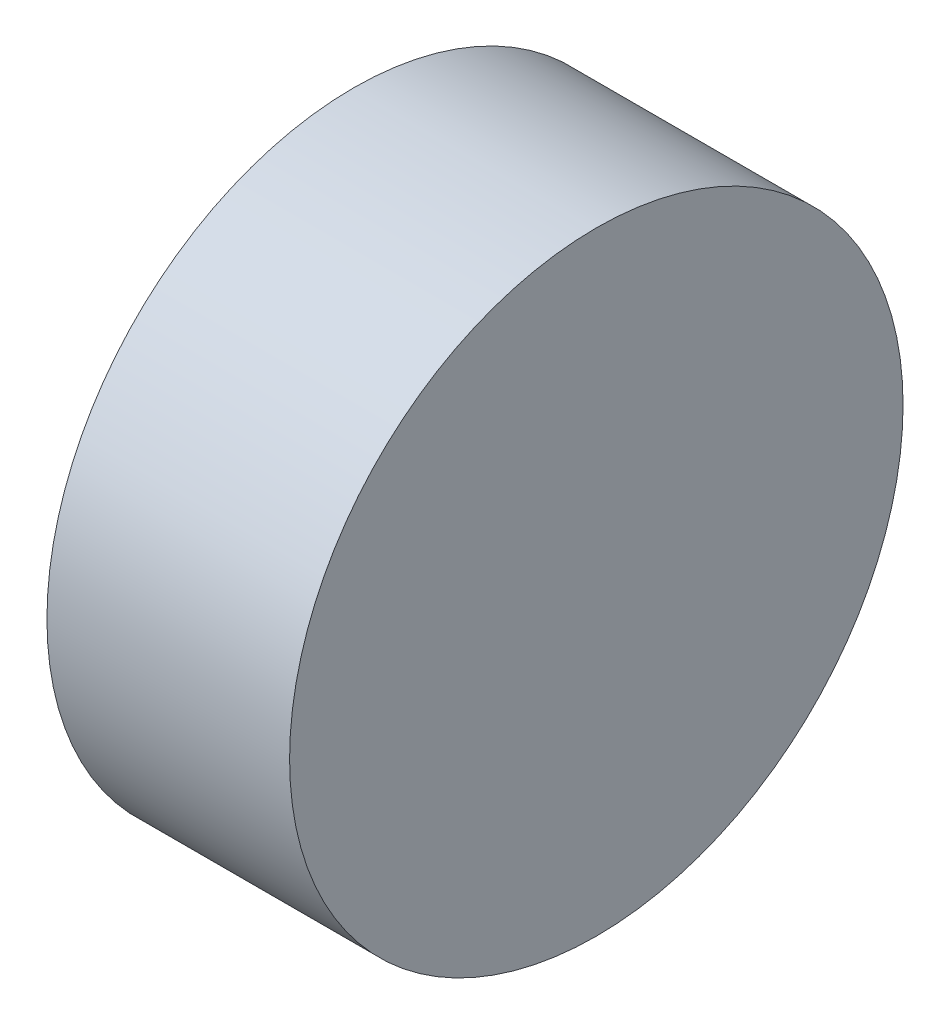
ISO-10303-21;
HEADER;
FILE_DESCRIPTION(('STEP AP214'),'2;1');
FILE_NAME('part.step','',(''),(''),'','','');
FILE_SCHEMA(('AUTOMOTIVE_DESIGN { 1 0 10303 214 1 1 1 1 }'));
ENDSEC;
DATA;
#1=APPLICATION_CONTEXT('core data for automotive mechanical design processes');
#2=APPLICATION_PROTOCOL_DEFINITION('international standard','automotive_design',2000,#1);
#3=PRODUCT_CONTEXT('',#1,'mechanical');
#4=PRODUCT('Part','Part','',(#3));
#5=PRODUCT_RELATED_PRODUCT_CATEGORY('part','',(#4));
#6=PRODUCT_DEFINITION_FORMATION('','',#4);
#7=PRODUCT_DEFINITION_CONTEXT('part definition',#1,'design');
#8=PRODUCT_DEFINITION('design','',#6,#7);
#9=PRODUCT_DEFINITION_SHAPE('','',#8);
#10=(LENGTH_UNIT() NAMED_UNIT(*) SI_UNIT(.MILLI.,.METRE.));
#11=(NAMED_UNIT(*) PLANE_ANGLE_UNIT() SI_UNIT($,.RADIAN.));
#12=(NAMED_UNIT(*) SI_UNIT($,.STERADIAN.) SOLID_ANGLE_UNIT());
#13=UNCERTAINTY_MEASURE_WITH_UNIT(LENGTH_MEASURE(1.E-05),#10,'distance_accuracy_value','');
#14=(GEOMETRIC_REPRESENTATION_CONTEXT(3) GLOBAL_UNCERTAINTY_ASSIGNED_CONTEXT((#13)) GLOBAL_UNIT_ASSIGNED_CONTEXT((#10,
#11,#12)) REPRESENTATION_CONTEXT('',''));
#15=CARTESIAN_POINT('',(0.,0.,0.));
#16=DIRECTION('',(0.,0.,1.));
#17=DIRECTION('',(1.,0.,0.));
#18=AXIS2_PLACEMENT_3D('',#15,#16,#17);
#19=CARTESIAN_POINT('',(0.,0.,0.));
#20=DIRECTION('',(1.,0.,0.));
#21=DIRECTION('',(0.,0.,-1.));
#22=AXIS2_PLACEMENT_3D('',#19,#20,#21);
#23=PLANE('',#22);
#24=CARTESIAN_POINT('',(0.,0.,0.));
#25=DIRECTION('',(1.,0.,0.));
#26=DIRECTION('',(0.,0.,-1.));
#27=AXIS2_PLACEMENT_3D('',#24,#25,#26);
#28=CIRCLE('',#27,33.5);
#29=CARTESIAN_POINT('',(0.,0.,-33.5));
#30=VERTEX_POINT('',#29);
#31=EDGE_CURVE('E44',#30,#30,#28,.T.);
#32=ORIENTED_EDGE('',*,*,#31,.F.);
#33=EDGE_LOOP('',(#32));
#34=FACE_BOUND('',#33,.T.);
#35=CARTESIAN_POINT('',(0.,0.,0.));
#36=DIRECTION('',(1.,0.,0.));
#37=DIRECTION('',(0.,0.,-1.));
#38=AXIS2_PLACEMENT_3D('',#35,#36,#37);
#39=CIRCLE('',#38,5.75);
#40=CARTESIAN_POINT('',(0.,0.,-5.75));
#41=VERTEX_POINT('',#40);
#42=EDGE_CURVE('E10',#41,#41,#39,.F.);
#43=ORIENTED_EDGE('',*,*,#42,.F.);
#44=EDGE_LOOP('',(#43));
#45=FACE_BOUND('',#44,.T.);
#46=ADVANCED_FACE('F33',(#34,#45),#23,.F.);
#47=CARTESIAN_POINT('',(26.5,0.,0.));
#48=DIRECTION('',(-1.,0.,0.));
#49=DIRECTION('',(0.,0.,1.));
#50=AXIS2_PLACEMENT_3D('',#47,#48,#49);
#51=CYLINDRICAL_SURFACE('',#50,33.5);
#52=CARTESIAN_POINT('',(26.5,0.,0.));
#53=DIRECTION('',(1.,0.,0.));
#54=DIRECTION('',(0.,0.,-1.));
#55=AXIS2_PLACEMENT_3D('',#52,#53,#54);
#56=CIRCLE('',#55,33.5);
#57=CARTESIAN_POINT('',(26.5,0.,-33.5));
#58=VERTEX_POINT('',#57);
#59=EDGE_CURVE('E40',#58,#58,#56,.T.);
#60=ORIENTED_EDGE('',*,*,#59,.F.);
#61=EDGE_LOOP('',(#60));
#62=FACE_BOUND('',#61,.T.);
#63=ORIENTED_EDGE('',*,*,#31,.T.);
#64=EDGE_LOOP('',(#63));
#65=FACE_BOUND('',#64,.T.);
#66=ADVANCED_FACE('F35',(#62,#65),#51,.T.);
#67=CARTESIAN_POINT('',(26.5,0.,0.));
#68=DIRECTION('',(1.,0.,0.));
#69=DIRECTION('',(0.,0.,-1.));
#70=AXIS2_PLACEMENT_3D('',#67,#68,#69);
#71=PLANE('',#70);
#72=ORIENTED_EDGE('',*,*,#59,.T.);
#73=EDGE_LOOP('',(#72));
#74=FACE_BOUND('',#73,.T.);
#75=ADVANCED_FACE('F65',(#74),#71,.T.);
#76=CARTESIAN_POINT('',(-2.5,0.,0.));
#77=DIRECTION('',(-1.,0.,0.));
#78=DIRECTION('',(0.,0.,1.));
#79=AXIS2_PLACEMENT_3D('',#76,#77,#78);
#80=PLANE('',#79);
#81=CARTESIAN_POINT('',(-2.5,0.,0.));
#82=DIRECTION('',(-1.,0.,0.));
#83=DIRECTION('',(0.,0.,1.));
#84=AXIS2_PLACEMENT_3D('',#81,#82,#83);
#85=CIRCLE('',#84,5.75);
#86=CARTESIAN_POINT('',(-2.5,0.,5.75));
#87=VERTEX_POINT('',#86);
#88=EDGE_CURVE('E53',#87,#87,#85,.T.);
#89=ORIENTED_EDGE('',*,*,#88,.T.);
#90=EDGE_LOOP('',(#89));
#91=FACE_BOUND('',#90,.T.);
#92=CARTESIAN_POINT('',(-2.5,0.,0.));
#93=DIRECTION('',(-1.,0.,0.));
#94=DIRECTION('',(0.,0.,1.));
#95=AXIS2_PLACEMENT_3D('',#92,#93,#94);
#96=CIRCLE('',#95,3.);
#97=CARTESIAN_POINT('',(-2.5,0.,3.));
#98=VERTEX_POINT('',#97);
#99=EDGE_CURVE('E56',#98,#98,#96,.T.);
#100=ORIENTED_EDGE('',*,*,#99,.F.);
#101=EDGE_LOOP('',(#100));
#102=FACE_BOUND('',#101,.T.);
#103=ADVANCED_FACE('F62',(#91,#102),#80,.T.);
#104=CARTESIAN_POINT('',(-2.5,0.,0.));
#105=DIRECTION('',(1.,0.,0.));
#106=DIRECTION('',(0.,0.,-1.));
#107=AXIS2_PLACEMENT_3D('',#104,#105,#106);
#108=CYLINDRICAL_SURFACE('',#107,5.75);
#109=ORIENTED_EDGE('',*,*,#88,.F.);
#110=EDGE_LOOP('',(#109));
#111=FACE_BOUND('',#110,.T.);
#112=ORIENTED_EDGE('',*,*,#42,.T.);
#113=EDGE_LOOP('',(#112));
#114=FACE_BOUND('',#113,.T.);
#115=ADVANCED_FACE('F64',(#111,#114),#108,.T.);
#116=CARTESIAN_POINT('',(9.,0.,0.));
#117=DIRECTION('',(-1.,0.,0.));
#118=DIRECTION('',(0.,0.,1.));
#119=AXIS2_PLACEMENT_3D('',#116,#117,#118);
#120=PLANE('',#119);
#121=CARTESIAN_POINT('',(9.,0.,0.));
#122=DIRECTION('',(-1.,0.,0.));
#123=DIRECTION('',(0.,0.,1.));
#124=AXIS2_PLACEMENT_3D('',#121,#122,#123);
#125=CIRCLE('',#124,3.);
#126=CARTESIAN_POINT('',(9.,0.,3.));
#127=VERTEX_POINT('',#126);
#128=EDGE_CURVE('E49',#127,#127,#125,.T.);
#129=ORIENTED_EDGE('',*,*,#128,.T.);
#130=EDGE_LOOP('',(#129));
#131=FACE_BOUND('',#130,.T.);
#132=ADVANCED_FACE('F72',(#131),#120,.T.);
#133=CARTESIAN_POINT('',(9.,0.,0.));
#134=DIRECTION('',(-1.,0.,0.));
#135=DIRECTION('',(0.,0.,1.));
#136=AXIS2_PLACEMENT_3D('',#133,#134,#135);
#137=CYLINDRICAL_SURFACE('',#136,3.);
#138=ORIENTED_EDGE('',*,*,#128,.F.);
#139=EDGE_LOOP('',(#138));
#140=FACE_BOUND('',#139,.T.);
#141=ORIENTED_EDGE('',*,*,#99,.T.);
#142=EDGE_LOOP('',(#141));
#143=FACE_BOUND('',#142,.T.);
#144=ADVANCED_FACE('F60',(#140,#143),#137,.F.);
#145=CLOSED_SHELL('',(#46,#66,#75,#103,#115,#132,#144));
#146=MANIFOLD_SOLID_BREP('B2',#145);
#147=ADVANCED_BREP_SHAPE_REPRESENTATION('',(#18,#146),#14);
#148=SHAPE_DEFINITION_REPRESENTATION(#9,#147);
ENDSEC;
END-ISO-10303-21;
